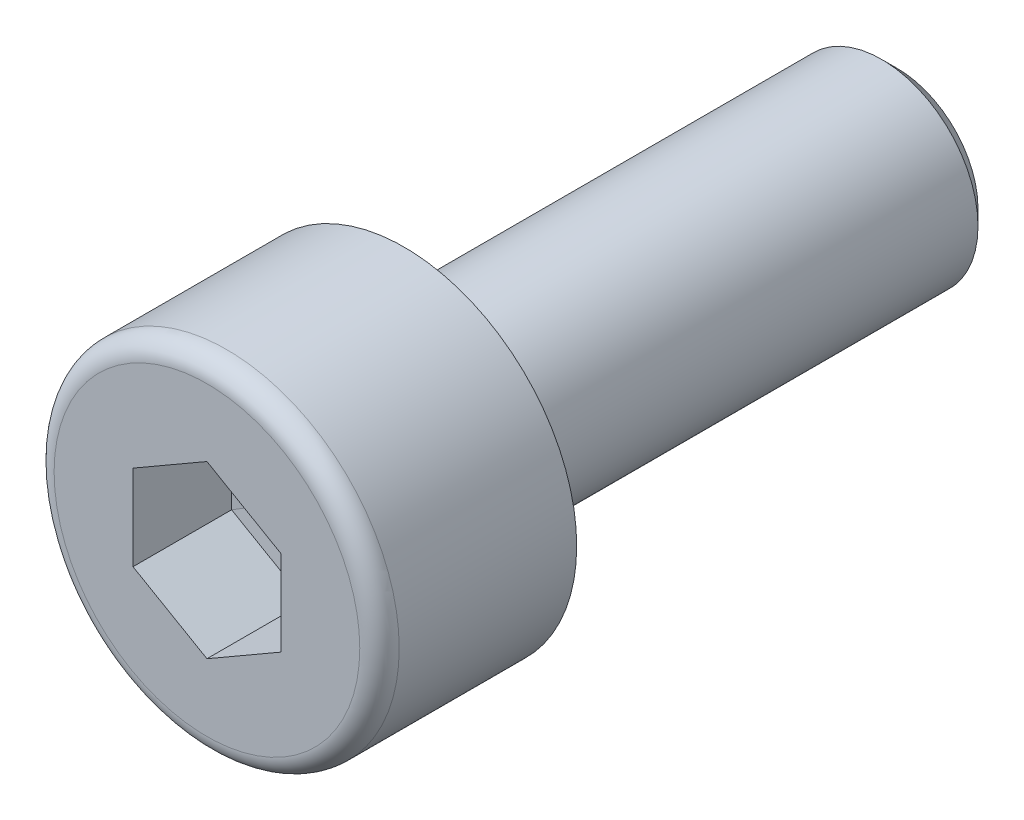
ISO-10303-21;
HEADER;
FILE_DESCRIPTION(('STEP AP214'),'2;1');
FILE_NAME('part.step','',(''),(''),'','','');
FILE_SCHEMA(('AUTOMOTIVE_DESIGN { 1 0 10303 214 1 1 1 1 }'));
ENDSEC;
DATA;
#1=APPLICATION_CONTEXT('core data for automotive mechanical design processes');
#2=APPLICATION_PROTOCOL_DEFINITION('international standard','automotive_design',2000,#1);
#3=PRODUCT_CONTEXT('',#1,'mechanical');
#4=PRODUCT('Part','Part','',(#3));
#5=PRODUCT_RELATED_PRODUCT_CATEGORY('part','',(#4));
#6=PRODUCT_DEFINITION_FORMATION('','',#4);
#7=PRODUCT_DEFINITION_CONTEXT('part definition',#1,'design');
#8=PRODUCT_DEFINITION('design','',#6,#7);
#9=PRODUCT_DEFINITION_SHAPE('','',#8);
#10=(LENGTH_UNIT() NAMED_UNIT(*) SI_UNIT(.MILLI.,.METRE.));
#11=(NAMED_UNIT(*) PLANE_ANGLE_UNIT() SI_UNIT($,.RADIAN.));
#12=(NAMED_UNIT(*) SI_UNIT($,.STERADIAN.) SOLID_ANGLE_UNIT());
#13=UNCERTAINTY_MEASURE_WITH_UNIT(LENGTH_MEASURE(1.E-05),#10,'distance_accuracy_value','');
#14=(GEOMETRIC_REPRESENTATION_CONTEXT(3) GLOBAL_UNCERTAINTY_ASSIGNED_CONTEXT((#13)) GLOBAL_UNIT_ASSIGNED_CONTEXT((#10,
#11,#12)) REPRESENTATION_CONTEXT('',''));
#15=CARTESIAN_POINT('',(0.,0.,0.));
#16=DIRECTION('',(0.,0.,1.));
#17=DIRECTION('',(1.,0.,0.));
#18=AXIS2_PLACEMENT_3D('',#15,#16,#17);
#19=CARTESIAN_POINT('',(-2.,0.,-5.53261747218209E-13));
#20=DIRECTION('',(0.,0.,-1.));
#21=DIRECTION('',(-1.,0.,0.));
#22=AXIS2_PLACEMENT_3D('',#19,#20,#21);
#23=PLANE('',#22);
#24=CARTESIAN_POINT('',(0.,0.,-5.56776846849516E-13));
#25=DIRECTION('',(0.,0.,-1.));
#26=DIRECTION('',(-1.,0.,0.));
#27=AXIS2_PLACEMENT_3D('',#24,#25,#26);
#28=CIRCLE('',#27,1.954);
#29=CARTESIAN_POINT('',(1.954,0.,-5.60049505988461E-13));
#30=VERTEX_POINT('',#29);
#31=EDGE_CURVE('E11',#30,#30,#28,.T.);
#32=ORIENTED_EDGE('',*,*,#31,.F.);
#33=EDGE_LOOP('',(#32));
#34=FACE_BOUND('',#33,.T.);
#35=CARTESIAN_POINT('',(0.,0.,-9.73874827926848E-13));
#36=DIRECTION('',(0.,0.,-1.));
#37=DIRECTION('',(1.,0.,0.));
#38=AXIS2_PLACEMENT_3D('',#35,#36,#37);
#39=CIRCLE('',#38,3.5);
#40=CARTESIAN_POINT('',(3.5,0.,-9.79494263475544E-13));
#41=VERTEX_POINT('',#40);
#42=EDGE_CURVE('E144',#41,#41,#39,.T.);
#43=ORIENTED_EDGE('',*,*,#42,.T.);
#44=EDGE_LOOP('',(#43));
#45=FACE_BOUND('',#44,.T.);
#46=ADVANCED_FACE('F17',(#34,#45),#23,.T.);
#47=CARTESIAN_POINT('',(0.,0.,-10.));
#48=DIRECTION('',(0.,0.,-1.));
#49=DIRECTION('',(-1.,0.,0.));
#50=AXIS2_PLACEMENT_3D('',#47,#48,#49);
#51=PLANE('',#50);
#52=CARTESIAN_POINT('',(0.,0.,-10.));
#53=DIRECTION('',(0.,0.,-1.));
#54=DIRECTION('',(-1.,0.,0.));
#55=AXIS2_PLACEMENT_3D('',#52,#53,#54);
#56=CIRCLE('',#55,1.64000000000125);
#57=CARTESIAN_POINT('',(1.64000000000125,0.,-10.));
#58=VERTEX_POINT('',#57);
#59=EDGE_CURVE('E124',#58,#58,#56,.T.);
#60=ORIENTED_EDGE('',*,*,#59,.T.);
#61=EDGE_LOOP('',(#60));
#62=FACE_BOUND('',#61,.T.);
#63=ADVANCED_FACE('F294',(#62),#51,.T.);
#64=CARTESIAN_POINT('',(0.,0.,-5.00000000000028));
#65=DIRECTION('',(0.,0.,-1.));
#66=DIRECTION('',(-1.,0.,0.));
#67=AXIS2_PLACEMENT_3D('',#64,#65,#66);
#68=CYLINDRICAL_SURFACE('',#67,1.954);
#69=CARTESIAN_POINT('',(0.,0.,-9.68600000000157));
#70=DIRECTION('',(0.,0.,1.));
#71=DIRECTION('',(-1.,0.,0.));
#72=AXIS2_PLACEMENT_3D('',#69,#70,#71);
#73=CIRCLE('',#72,1.954);
#74=CARTESIAN_POINT('',(1.954,0.,-9.68600000000157));
#75=VERTEX_POINT('',#74);
#76=EDGE_CURVE('E116',#75,#75,#73,.T.);
#77=ORIENTED_EDGE('',*,*,#76,.T.);
#78=DIRECTION('',(0.,0.,1.));
#79=VECTOR('',#78,1.);
#80=CARTESIAN_POINT('',(1.954,0.,-5.00000000000028));
#81=LINE('',#80,#79);
#82=EDGE_CURVE('E25',#75,#30,#81,.T.);
#83=ORIENTED_EDGE('',*,*,#82,.T.);
#84=ORIENTED_EDGE('',*,*,#31,.T.);
#85=ORIENTED_EDGE('',*,*,#82,.F.);
#86=EDGE_LOOP('',(#77,#83,#84,#85));
#87=FACE_BOUND('',#86,.T.);
#88=ADVANCED_FACE('F114',(#87),#68,.T.);
#89=CARTESIAN_POINT('',(-1.5,-0.866025403784439,4.));
#90=DIRECTION('',(-1.,0.,0.));
#91=DIRECTION('',(0.,0.,1.));
#92=AXIS2_PLACEMENT_3D('',#89,#90,#91);
#93=PLANE('',#92);
#94=DIRECTION('',(0.,1.,0.));
#95=VECTOR('',#94,1.);
#96=CARTESIAN_POINT('',(-1.5,-0.433012701892219,3.99999999999961));
#97=LINE('',#96,#95);
#98=CARTESIAN_POINT('',(-1.5,-0.866025403784439,4.));
#99=VERTEX_POINT('',#98);
#100=CARTESIAN_POINT('',(-1.5,0.866025403784438,4.));
#101=VERTEX_POINT('',#100);
#102=EDGE_CURVE('E140',#99,#101,#97,.T.);
#103=ORIENTED_EDGE('',*,*,#102,.F.);
#104=DIRECTION('',(0.,0.,-1.));
#105=VECTOR('',#104,1.);
#106=CARTESIAN_POINT('',(-1.5,-0.866025403784439,4.));
#107=LINE('',#106,#105);
#108=CARTESIAN_POINT('',(-1.5,-0.866025403784439,2.));
#109=VERTEX_POINT('',#108);
#110=EDGE_CURVE('E118',#99,#109,#107,.T.);
#111=ORIENTED_EDGE('',*,*,#110,.T.);
#112=DIRECTION('',(0.,1.,0.));
#113=VECTOR('',#112,1.);
#114=CARTESIAN_POINT('',(-1.5,-0.866025403784439,2.));
#115=LINE('',#114,#113);
#116=CARTESIAN_POINT('',(-1.5,0.866025403784438,2.));
#117=VERTEX_POINT('',#116);
#118=EDGE_CURVE('E212',#109,#117,#115,.T.);
#119=ORIENTED_EDGE('',*,*,#118,.T.);
#120=DIRECTION('',(0.,0.,-1.));
#121=VECTOR('',#120,1.);
#122=CARTESIAN_POINT('',(-1.5,0.866025403784438,4.));
#123=LINE('',#122,#121);
#124=EDGE_CURVE('E44',#101,#117,#123,.T.);
#125=ORIENTED_EDGE('',*,*,#124,.F.);
#126=EDGE_LOOP('',(#103,#111,#119,#125));
#127=FACE_BOUND('',#126,.T.);
#128=ADVANCED_FACE('F242',(#127),#93,.F.);
#129=CARTESIAN_POINT('',(0.,-1.73205080756888,4.));
#130=DIRECTION('',(-0.5,-0.866025403784439,0.));
#131=DIRECTION('',(-0.866025403784439,0.5,0.));
#132=AXIS2_PLACEMENT_3D('',#129,#130,#131);
#133=PLANE('',#132);
#134=DIRECTION('',(-0.866025403784439,0.5,0.));
#135=VECTOR('',#134,1.);
#136=CARTESIAN_POINT('',(-1.6875,-0.757772228311382,3.99999999999961));
#137=LINE('',#136,#135);
#138=CARTESIAN_POINT('',(0.,-1.73205080756888,4.));
#139=VERTEX_POINT('',#138);
#140=EDGE_CURVE('E145',#139,#99,#137,.T.);
#141=ORIENTED_EDGE('',*,*,#140,.F.);
#142=DIRECTION('',(0.,0.,-1.));
#143=VECTOR('',#142,1.);
#144=CARTESIAN_POINT('',(0.,-1.73205080756888,4.));
#145=LINE('',#144,#143);
#146=CARTESIAN_POINT('',(0.,-1.73205080756888,2.));
#147=VERTEX_POINT('',#146);
#148=EDGE_CURVE('E233',#139,#147,#145,.T.);
#149=ORIENTED_EDGE('',*,*,#148,.T.);
#150=DIRECTION('',(-0.866025403784439,0.5,0.));
#151=VECTOR('',#150,1.);
#152=CARTESIAN_POINT('',(0.,-1.73205080756888,2.));
#153=LINE('',#152,#151);
#154=EDGE_CURVE('E146',#147,#109,#153,.T.);
#155=ORIENTED_EDGE('',*,*,#154,.T.);
#156=ORIENTED_EDGE('',*,*,#110,.F.);
#157=EDGE_LOOP('',(#141,#149,#155,#156));
#158=FACE_BOUND('',#157,.T.);
#159=ADVANCED_FACE('F251',(#158),#133,.F.);
#160=CARTESIAN_POINT('',(1.5,-0.866025403784439,4.));
#161=DIRECTION('',(0.5,-0.866025403784439,0.));
#162=DIRECTION('',(0.,0.,-1.));
#163=AXIS2_PLACEMENT_3D('',#160,#161,#162);
#164=PLANE('',#163);
#165=DIRECTION('',(-0.866025403784439,-0.5,0.));
#166=VECTOR('',#165,1.);
#167=CARTESIAN_POINT('',(-0.187500000000004,-1.84030398304193,3.99999999999961));
#168=LINE('',#167,#166);
#169=CARTESIAN_POINT('',(1.5,-0.866025403784439,4.));
#170=VERTEX_POINT('',#169);
#171=EDGE_CURVE('E172',#170,#139,#168,.T.);
#172=ORIENTED_EDGE('',*,*,#171,.F.);
#173=DIRECTION('',(0.,0.,-1.));
#174=VECTOR('',#173,1.);
#175=CARTESIAN_POINT('',(1.5,-0.866025403784439,4.));
#176=LINE('',#175,#174);
#177=CARTESIAN_POINT('',(1.5,-0.866025403784439,2.));
#178=VERTEX_POINT('',#177);
#179=EDGE_CURVE('E230',#170,#178,#176,.T.);
#180=ORIENTED_EDGE('',*,*,#179,.T.);
#181=DIRECTION('',(-0.866025403784439,-0.5,0.));
#182=VECTOR('',#181,1.);
#183=CARTESIAN_POINT('',(1.5,-0.866025403784439,2.));
#184=LINE('',#183,#182);
#185=EDGE_CURVE('E189',#178,#147,#184,.T.);
#186=ORIENTED_EDGE('',*,*,#185,.T.);
#187=ORIENTED_EDGE('',*,*,#148,.F.);
#188=EDGE_LOOP('',(#172,#180,#186,#187));
#189=FACE_BOUND('',#188,.T.);
#190=ADVANCED_FACE('F279',(#189),#164,.F.);
#191=CARTESIAN_POINT('',(1.5,0.866025403784439,4.));
#192=DIRECTION('',(1.,0.,0.));
#193=DIRECTION('',(0.,-1.,0.));
#194=AXIS2_PLACEMENT_3D('',#191,#192,#193);
#195=PLANE('',#194);
#196=DIRECTION('',(0.,-1.,0.));
#197=VECTOR('',#196,1.);
#198=CARTESIAN_POINT('',(1.5,0.433012701892219,3.99999999999961));
#199=LINE('',#198,#197);
#200=CARTESIAN_POINT('',(1.5,0.866025403784439,4.));
#201=VERTEX_POINT('',#200);
#202=EDGE_CURVE('E176',#201,#170,#199,.T.);
#203=ORIENTED_EDGE('',*,*,#202,.F.);
#204=DIRECTION('',(0.,0.,-1.));
#205=VECTOR('',#204,1.);
#206=CARTESIAN_POINT('',(1.5,0.866025403784439,4.));
#207=LINE('',#206,#205);
#208=CARTESIAN_POINT('',(1.5,0.866025403784439,2.));
#209=VERTEX_POINT('',#208);
#210=EDGE_CURVE('E197',#201,#209,#207,.T.);
#211=ORIENTED_EDGE('',*,*,#210,.T.);
#212=DIRECTION('',(0.,-1.,0.));
#213=VECTOR('',#212,1.);
#214=CARTESIAN_POINT('',(1.5,0.866025403784439,2.));
#215=LINE('',#214,#213);
#216=EDGE_CURVE('E201',#209,#178,#215,.T.);
#217=ORIENTED_EDGE('',*,*,#216,.T.);
#218=ORIENTED_EDGE('',*,*,#179,.F.);
#219=EDGE_LOOP('',(#203,#211,#217,#218));
#220=FACE_BOUND('',#219,.T.);
#221=ADVANCED_FACE('F281',(#220),#195,.F.);
#222=CARTESIAN_POINT('',(0.,1.73205080756888,4.));
#223=DIRECTION('',(0.5,0.866025403784439,0.));
#224=DIRECTION('',(0.,0.,-1.));
#225=AXIS2_PLACEMENT_3D('',#222,#223,#224);
#226=PLANE('',#225);
#227=DIRECTION('',(0.866025403784439,-0.5,0.));
#228=VECTOR('',#227,1.);
#229=CARTESIAN_POINT('',(-0.9375,2.27331668493415,3.99999999999961));
#230=LINE('',#229,#228);
#231=CARTESIAN_POINT('',(0.,1.73205080756888,4.));
#232=VERTEX_POINT('',#231);
#233=EDGE_CURVE('E166',#232,#201,#230,.T.);
#234=ORIENTED_EDGE('',*,*,#233,.F.);
#235=DIRECTION('',(0.,0.,-1.));
#236=VECTOR('',#235,1.);
#237=CARTESIAN_POINT('',(0.,1.73205080756888,4.));
#238=LINE('',#237,#236);
#239=CARTESIAN_POINT('',(0.,1.73205080756888,2.));
#240=VERTEX_POINT('',#239);
#241=EDGE_CURVE('E194',#232,#240,#238,.T.);
#242=ORIENTED_EDGE('',*,*,#241,.T.);
#243=DIRECTION('',(0.866025403784439,-0.5,0.));
#244=VECTOR('',#243,1.);
#245=CARTESIAN_POINT('',(0.,1.73205080756888,2.));
#246=LINE('',#245,#244);
#247=EDGE_CURVE('E209',#240,#209,#246,.T.);
#248=ORIENTED_EDGE('',*,*,#247,.T.);
#249=ORIENTED_EDGE('',*,*,#210,.F.);
#250=EDGE_LOOP('',(#234,#242,#248,#249));
#251=FACE_BOUND('',#250,.T.);
#252=ADVANCED_FACE('F272',(#251),#226,.F.);
#253=CARTESIAN_POINT('',(-1.5,0.86602540378444,4.));
#254=DIRECTION('',(-0.5,0.866025403784439,0.));
#255=DIRECTION('',(0.,0.,1.));
#256=AXIS2_PLACEMENT_3D('',#253,#254,#255);
#257=PLANE('',#256);
#258=DIRECTION('',(0.866025403784439,0.5,0.));
#259=VECTOR('',#258,1.);
#260=CARTESIAN_POINT('',(-2.4375,0.324759526419164,3.99999999999962));
#261=LINE('',#260,#259);
#262=EDGE_CURVE('E155',#101,#232,#261,.T.);
#263=ORIENTED_EDGE('',*,*,#262,.F.);
#264=ORIENTED_EDGE('',*,*,#124,.T.);
#265=DIRECTION('',(0.866025403784439,0.5,0.));
#266=VECTOR('',#265,1.);
#267=CARTESIAN_POINT('',(-1.5,0.86602540378444,2.));
#268=LINE('',#267,#266);
#269=EDGE_CURVE('E220',#117,#240,#268,.T.);
#270=ORIENTED_EDGE('',*,*,#269,.T.);
#271=ORIENTED_EDGE('',*,*,#241,.F.);
#272=EDGE_LOOP('',(#263,#264,#270,#271));
#273=FACE_BOUND('',#272,.T.);
#274=ADVANCED_FACE('F269',(#273),#257,.F.);
#275=CARTESIAN_POINT('',(-1.5,0.866025403784438,2.));
#276=DIRECTION('',(-0.0871557427476581,0.,-0.996194698091746));
#277=DIRECTION('',(-0.996194698091746,0.,0.0871557427476581));
#278=AXIS2_PLACEMENT_3D('',#275,#276,#277);
#279=PLANE('',#278);
#280=DIRECTION('',(0.863550259614423,-0.498570974847159,-0.0755508581011305));
#281=VECTOR('',#280,1.);
#282=CARTESIAN_POINT('',(-1.12714047455993,0.6507548564017,1.96737901843634));
#283=LINE('',#282,#281);
#284=CARTESIAN_POINT('',(0.,0.,1.86876700471111));
#285=VERTEX_POINT('',#284);
#286=EDGE_CURVE('E223',#117,#285,#283,.T.);
#287=ORIENTED_EDGE('',*,*,#286,.F.);
#288=ORIENTED_EDGE('',*,*,#118,.F.);
#289=DIRECTION('',(0.863550259614423,0.498570974847158,-0.0755508581011305));
#290=VECTOR('',#289,1.);
#291=CARTESIAN_POINT('',(-1.12714047455993,-0.6507548564017,1.96737901843634));
#292=LINE('',#291,#290);
#293=EDGE_CURVE('E151',#109,#285,#292,.T.);
#294=ORIENTED_EDGE('',*,*,#293,.T.);
#295=EDGE_LOOP('',(#287,#288,#294));
#296=FACE_BOUND('',#295,.T.);
#297=ADVANCED_FACE('F247',(#296),#279,.F.);
#298=CARTESIAN_POINT('',(0.,1.73205080756888,2.));
#299=DIRECTION('',(-0.043577871373829,0.0754790873051733,-0.996194698091746));
#300=DIRECTION('',(-0.999044587684655,0.,0.043702537889669));
#301=AXIS2_PLACEMENT_3D('',#298,#299,#300);
#302=PLANE('',#301);
#303=DIRECTION('',(0.,-0.997141949694317,-0.0755508581011306));
#304=VECTOR('',#303,1.);
#305=CARTESIAN_POINT('',(0.,1.3015097128034,1.96737901843634));
#306=LINE('',#305,#304);
#307=EDGE_CURVE('E216',#240,#285,#306,.T.);
#308=ORIENTED_EDGE('',*,*,#307,.F.);
#309=ORIENTED_EDGE('',*,*,#269,.F.);
#310=ORIENTED_EDGE('',*,*,#286,.T.);
#311=EDGE_LOOP('',(#308,#309,#310));
#312=FACE_BOUND('',#311,.T.);
#313=ADVANCED_FACE('F268',(#312),#302,.F.);
#314=CARTESIAN_POINT('',(1.5,0.866025403784439,2.));
#315=DIRECTION('',(0.0435778713738291,0.0754790873051733,-0.996194698091746));
#316=DIRECTION('',(-0.999044587684655,0.,-0.0437025378896691));
#317=AXIS2_PLACEMENT_3D('',#314,#315,#316);
#318=PLANE('',#317);
#319=DIRECTION('',(-0.863550259614423,-0.498570974847158,-0.0755508581011305));
#320=VECTOR('',#319,1.);
#321=CARTESIAN_POINT('',(1.12714047455993,0.650754856401705,1.96737901843634));
#322=LINE('',#321,#320);
#323=EDGE_CURVE('E205',#209,#285,#322,.T.);
#324=ORIENTED_EDGE('',*,*,#323,.F.);
#325=ORIENTED_EDGE('',*,*,#247,.F.);
#326=ORIENTED_EDGE('',*,*,#307,.T.);
#327=EDGE_LOOP('',(#324,#325,#326));
#328=FACE_BOUND('',#327,.T.);
#329=ADVANCED_FACE('F265',(#328),#318,.F.);
#330=CARTESIAN_POINT('',(1.5,-0.866025403784439,2.));
#331=DIRECTION('',(0.0871557427476581,0.,-0.996194698091746));
#332=DIRECTION('',(0.,-1.,0.));
#333=AXIS2_PLACEMENT_3D('',#330,#331,#332);
#334=PLANE('',#333);
#335=DIRECTION('',(-0.863550259614423,0.498570974847158,-0.0755508581011305));
#336=VECTOR('',#335,1.);
#337=CARTESIAN_POINT('',(1.12714047455993,-0.650754856401705,1.96737901843634));
#338=LINE('',#337,#336);
#339=EDGE_CURVE('E193',#178,#285,#338,.T.);
#340=ORIENTED_EDGE('',*,*,#339,.F.);
#341=ORIENTED_EDGE('',*,*,#216,.F.);
#342=ORIENTED_EDGE('',*,*,#323,.T.);
#343=EDGE_LOOP('',(#340,#341,#342));
#344=FACE_BOUND('',#343,.T.);
#345=ADVANCED_FACE('F261',(#344),#334,.F.);
#346=CARTESIAN_POINT('',(0.,-1.73205080756888,2.));
#347=DIRECTION('',(0.043577871373829,-0.0754790873051733,-0.996194698091746));
#348=DIRECTION('',(0.,-0.997141949694317,0.0755508581011305));
#349=AXIS2_PLACEMENT_3D('',#346,#347,#348);
#350=PLANE('',#349);
#351=DIRECTION('',(0.,0.997141949694317,-0.0755508581011306));
#352=VECTOR('',#351,1.);
#353=CARTESIAN_POINT('',(0.,-1.3015097128034,1.96737901843634));
#354=LINE('',#353,#352);
#355=EDGE_CURVE('E150',#147,#285,#354,.T.);
#356=ORIENTED_EDGE('',*,*,#355,.F.);
#357=ORIENTED_EDGE('',*,*,#185,.F.);
#358=ORIENTED_EDGE('',*,*,#339,.T.);
#359=EDGE_LOOP('',(#356,#357,#358));
#360=FACE_BOUND('',#359,.T.);
#361=ADVANCED_FACE('F257',(#360),#350,.F.);
#362=CARTESIAN_POINT('',(-1.5,-0.866025403784439,2.));
#363=DIRECTION('',(-0.0435778713738291,-0.0754790873051733,-0.996194698091746));
#364=DIRECTION('',(0.,-0.997141949694317,0.0755508581011305));
#365=AXIS2_PLACEMENT_3D('',#362,#363,#364);
#366=PLANE('',#365);
#367=ORIENTED_EDGE('',*,*,#293,.F.);
#368=ORIENTED_EDGE('',*,*,#154,.F.);
#369=ORIENTED_EDGE('',*,*,#355,.T.);
#370=EDGE_LOOP('',(#367,#368,#369));
#371=FACE_BOUND('',#370,.T.);
#372=ADVANCED_FACE('F253',(#371),#366,.F.);
#373=CARTESIAN_POINT('',(0.,0.,1.99999999999932));
#374=DIRECTION('',(0.,0.,-1.));
#375=DIRECTION('',(-1.,0.,0.));
#376=AXIS2_PLACEMENT_3D('',#373,#374,#375);
#377=CYLINDRICAL_SURFACE('',#376,3.5);
#378=ORIENTED_EDGE('',*,*,#42,.F.);
#379=DIRECTION('',(0.,0.,1.));
#380=VECTOR('',#379,1.);
#381=CARTESIAN_POINT('',(3.5,0.,1.99999999999931));
#382=LINE('',#381,#380);
#383=CARTESIAN_POINT('',(3.5,0.,3.59999999999961));
#384=VERTEX_POINT('',#383);
#385=EDGE_CURVE('E162',#41,#384,#382,.T.);
#386=ORIENTED_EDGE('',*,*,#385,.T.);
#387=CARTESIAN_POINT('',(0.,0.,3.59999999999961));
#388=DIRECTION('',(0.,0.,1.));
#389=DIRECTION('',(1.,0.,0.));
#390=AXIS2_PLACEMENT_3D('',#387,#388,#389);
#391=CIRCLE('',#390,3.5);
#392=EDGE_CURVE('E132',#384,#384,#391,.T.);
#393=ORIENTED_EDGE('',*,*,#392,.F.);
#394=ORIENTED_EDGE('',*,*,#385,.F.);
#395=EDGE_LOOP('',(#378,#386,#393,#394));
#396=FACE_BOUND('',#395,.T.);
#397=ADVANCED_FACE('F304',(#396),#377,.T.);
#398=CARTESIAN_POINT('',(-3.5,0.,3.99999999999962));
#399=DIRECTION('',(0.,0.,1.));
#400=DIRECTION('',(1.,0.,0.));
#401=AXIS2_PLACEMENT_3D('',#398,#399,#400);
#402=PLANE('',#401);
#403=ORIENTED_EDGE('',*,*,#262,.T.);
#404=ORIENTED_EDGE('',*,*,#233,.T.);
#405=ORIENTED_EDGE('',*,*,#202,.T.);
#406=ORIENTED_EDGE('',*,*,#171,.T.);
#407=ORIENTED_EDGE('',*,*,#140,.T.);
#408=ORIENTED_EDGE('',*,*,#102,.T.);
#409=EDGE_LOOP('',(#403,#404,#405,#406,#407,#408));
#410=FACE_BOUND('',#409,.T.);
#411=CARTESIAN_POINT('',(0.,0.,3.99999999999961));
#412=DIRECTION('',(0.,0.,-1.));
#413=DIRECTION('',(1.,0.,0.));
#414=AXIS2_PLACEMENT_3D('',#411,#412,#413);
#415=CIRCLE('',#414,3.1);
#416=CARTESIAN_POINT('',(3.1,0.,3.99999999999961));
#417=VERTEX_POINT('',#416);
#418=EDGE_CURVE('E152',#417,#417,#415,.T.);
#419=ORIENTED_EDGE('',*,*,#418,.F.);
#420=EDGE_LOOP('',(#419));
#421=FACE_BOUND('',#420,.T.);
#422=ADVANCED_FACE('F275',(#410,#421),#402,.T.);
#423=CARTESIAN_POINT('',(0.,0.,3.59999999999961));
#424=DIRECTION('',(0.,0.,-1.));
#425=DIRECTION('',(-1.,0.,0.));
#426=AXIS2_PLACEMENT_3D('',#423,#424,#425);
#427=TOROIDAL_SURFACE('',#426,3.1,0.4);
#428=ORIENTED_EDGE('',*,*,#392,.T.);
#429=CARTESIAN_POINT('',(3.1,0.,3.59999999999961));
#430=DIRECTION('',(0.,-1.,0.));
#431=DIRECTION('',(1.,0.,0.));
#432=AXIS2_PLACEMENT_3D('',#429,#430,#431);
#433=CIRCLE('',#432,0.4);
#434=EDGE_CURVE('E139',#384,#417,#433,.T.);
#435=ORIENTED_EDGE('',*,*,#434,.T.);
#436=ORIENTED_EDGE('',*,*,#418,.T.);
#437=ORIENTED_EDGE('',*,*,#434,.F.);
#438=EDGE_LOOP('',(#428,#435,#436,#437));
#439=FACE_BOUND('',#438,.T.);
#440=ADVANCED_FACE('F308',(#439),#427,.T.);
#441=CARTESIAN_POINT('',(0.,0.,-9.8));
#442=DIRECTION('',(0.,0.,1.));
#443=DIRECTION('',(-1.,0.,0.));
#444=AXIS2_PLACEMENT_3D('',#441,#442,#443);
#445=CONICAL_SURFACE('',#444,1.84000000000145,0.785398163397965);
#446=ORIENTED_EDGE('',*,*,#76,.F.);
#447=DIRECTION('',(-0.707106781186913,0.,-0.707106781186182));
#448=VECTOR('',#447,1.);
#449=CARTESIAN_POINT('',(1.84000000000145,0.,-9.8));
#450=LINE('',#449,#448);
#451=EDGE_CURVE('E122',#75,#58,#450,.T.);
#452=ORIENTED_EDGE('',*,*,#451,.T.);
#453=ORIENTED_EDGE('',*,*,#59,.F.);
#454=ORIENTED_EDGE('',*,*,#451,.F.);
#455=EDGE_LOOP('',(#446,#452,#453,#454));
#456=FACE_BOUND('',#455,.T.);
#457=ADVANCED_FACE('F123',(#456),#445,.T.);
#458=CLOSED_SHELL('',(#46,#63,#88,#128,#159,#190,#221,#252,#274,#297,#313,#329,#345,#361,#372,
#397,#422,#440,#457));
#459=MANIFOLD_SOLID_BREP('B1',#458);
#460=ADVANCED_BREP_SHAPE_REPRESENTATION('',(#18,#459),#14);
#461=SHAPE_DEFINITION_REPRESENTATION(#9,#460);
ENDSEC;
END-ISO-10303-21;
